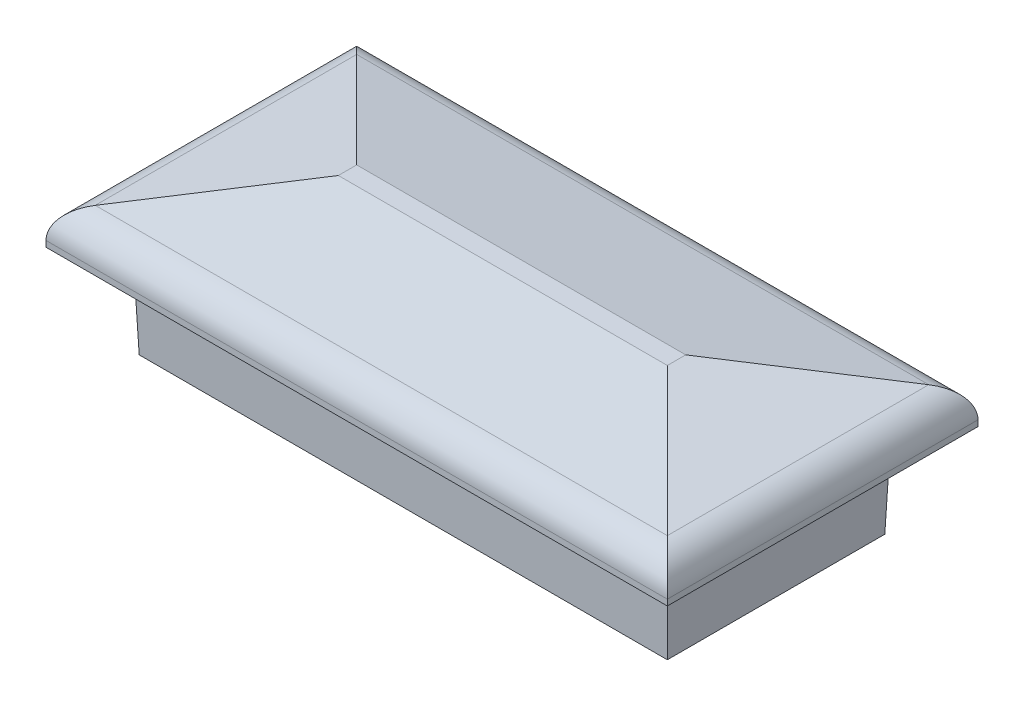
ISO-10303-21;
HEADER;
FILE_DESCRIPTION(('STEP AP214'),'2;1');
FILE_NAME('part.step','',(''),(''),'','','');
FILE_SCHEMA(('AUTOMOTIVE_DESIGN { 1 0 10303 214 1 1 1 1 }'));
ENDSEC;
DATA;
#1=APPLICATION_CONTEXT('core data for automotive mechanical design processes');
#2=APPLICATION_PROTOCOL_DEFINITION('international standard','automotive_design',2000,#1);
#3=PRODUCT_CONTEXT('',#1,'mechanical');
#4=PRODUCT('Part','Part','',(#3));
#5=PRODUCT_RELATED_PRODUCT_CATEGORY('part','',(#4));
#6=PRODUCT_DEFINITION_FORMATION('','',#4);
#7=PRODUCT_DEFINITION_CONTEXT('part definition',#1,'design');
#8=PRODUCT_DEFINITION('design','',#6,#7);
#9=PRODUCT_DEFINITION_SHAPE('','',#8);
#10=(LENGTH_UNIT() NAMED_UNIT(*) SI_UNIT(.MILLI.,.METRE.));
#11=(NAMED_UNIT(*) PLANE_ANGLE_UNIT() SI_UNIT($,.RADIAN.));
#12=(NAMED_UNIT(*) SI_UNIT($,.STERADIAN.) SOLID_ANGLE_UNIT());
#13=UNCERTAINTY_MEASURE_WITH_UNIT(LENGTH_MEASURE(1.E-05),#10,'distance_accuracy_value','');
#14=(GEOMETRIC_REPRESENTATION_CONTEXT(3) GLOBAL_UNCERTAINTY_ASSIGNED_CONTEXT((#13)) GLOBAL_UNIT_ASSIGNED_CONTEXT((#10,
#11,#12)) REPRESENTATION_CONTEXT('',''));
#15=CARTESIAN_POINT('',(0.,0.,0.));
#16=DIRECTION('',(0.,0.,1.));
#17=DIRECTION('',(1.,0.,0.));
#18=AXIS2_PLACEMENT_3D('',#15,#16,#17);
#19=CARTESIAN_POINT('',(0.,0.,0.));
#20=DIRECTION('',(0.,1.,0.));
#21=DIRECTION('',(0.,0.,1.));
#22=AXIS2_PLACEMENT_3D('',#19,#20,#21);
#23=PLANE('',#22);
#24=DIRECTION('',(-1.,0.,0.));
#25=VECTOR('',#24,1.);
#26=CARTESIAN_POINT('',(0.,0.,8.88999999999992));
#27=LINE('',#26,#25);
#28=CARTESIAN_POINT('',(21.5899999999999,0.,8.88999999999992));
#29=VERTEX_POINT('',#28);
#30=CARTESIAN_POINT('',(-21.5899999999999,0.,8.88999999999992));
#31=VERTEX_POINT('',#30);
#32=EDGE_CURVE('E234',#29,#31,#27,.T.);
#33=ORIENTED_EDGE('',*,*,#32,.T.);
#34=DIRECTION('',(0.,0.,-1.));
#35=VECTOR('',#34,1.);
#36=CARTESIAN_POINT('',(-21.5899999999999,0.,0.));
#37=LINE('',#36,#35);
#38=CARTESIAN_POINT('',(-21.5899999999999,0.,-8.88999999999992));
#39=VERTEX_POINT('',#38);
#40=EDGE_CURVE('E240',#31,#39,#37,.T.);
#41=ORIENTED_EDGE('',*,*,#40,.T.);
#42=DIRECTION('',(1.,0.,0.));
#43=VECTOR('',#42,1.);
#44=CARTESIAN_POINT('',(0.,0.,-8.88999999999992));
#45=LINE('',#44,#43);
#46=CARTESIAN_POINT('',(21.5899999999999,0.,-8.88999999999992));
#47=VERTEX_POINT('',#46);
#48=EDGE_CURVE('E238',#39,#47,#45,.T.);
#49=ORIENTED_EDGE('',*,*,#48,.T.);
#50=DIRECTION('',(0.,0.,1.));
#51=VECTOR('',#50,1.);
#52=CARTESIAN_POINT('',(21.5899999999999,0.,0.));
#53=LINE('',#52,#51);
#54=EDGE_CURVE('E236',#47,#29,#53,.T.);
#55=ORIENTED_EDGE('',*,*,#54,.T.);
#56=EDGE_LOOP('',(#33,#41,#49,#55));
#57=FACE_BOUND('',#56,.T.);
#58=DIRECTION('',(1.,0.,0.));
#59=VECTOR('',#58,1.);
#60=CARTESIAN_POINT('',(-21.971,0.,6.34845175748091));
#61=LINE('',#60,#59);
#62=CARTESIAN_POINT('',(19.0484517574809,0.,6.34845175748091));
#63=VERTEX_POINT('',#62);
#64=CARTESIAN_POINT('',(-19.0484517574809,0.,6.34845175748091));
#65=VERTEX_POINT('',#64);
#66=EDGE_CURVE('E199',#63,#65,#61,.F.);
#67=ORIENTED_EDGE('',*,*,#66,.F.);
#68=DIRECTION('',(0.,0.,-1.));
#69=VECTOR('',#68,1.);
#70=CARTESIAN_POINT('',(19.0484517574809,0.,-9.271));
#71=LINE('',#70,#69);
#72=CARTESIAN_POINT('',(19.0484517574809,0.,-6.34845175748092));
#73=VERTEX_POINT('',#72);
#74=EDGE_CURVE('E211',#73,#63,#71,.F.);
#75=ORIENTED_EDGE('',*,*,#74,.F.);
#76=DIRECTION('',(-1.,0.,0.));
#77=VECTOR('',#76,1.);
#78=CARTESIAN_POINT('',(-21.971,0.,-6.34845175748092));
#79=LINE('',#78,#77);
#80=CARTESIAN_POINT('',(-19.0484517574809,0.,-6.34845175748092));
#81=VERTEX_POINT('',#80);
#82=EDGE_CURVE('E213',#81,#73,#79,.F.);
#83=ORIENTED_EDGE('',*,*,#82,.F.);
#84=DIRECTION('',(0.,0.,1.));
#85=VECTOR('',#84,1.);
#86=CARTESIAN_POINT('',(-19.0484517574809,0.,-9.271));
#87=LINE('',#86,#85);
#88=EDGE_CURVE('E215',#65,#81,#87,.F.);
#89=ORIENTED_EDGE('',*,*,#88,.F.);
#90=EDGE_LOOP('',(#67,#75,#83,#89));
#91=FACE_BOUND('',#90,.T.);
#92=ADVANCED_FACE('F39',(#57,#91),#23,.F.);
#93=CARTESIAN_POINT('',(21.971,10.910412500794,-9.271));
#94=DIRECTION('',(-0.999390827019096,0.0348994967024979,0.));
#95=DIRECTION('',(0.,0.,-1.));
#96=AXIS2_PLACEMENT_3D('',#93,#94,#95);
#97=PLANE('',#96);
#98=DIRECTION('',(0.0348782627423715,0.998782765958718,0.0348782627423717));
#99=VECTOR('',#98,1.);
#100=CARTESIAN_POINT('',(21.9175448552815,9.37965743736147,9.21754485528155));
#101=LINE('',#100,#99);
#102=CARTESIAN_POINT('',(21.856096263527,7.62,9.15609626352702));
#103=VERTEX_POINT('',#102);
#104=EDGE_CURVE('E247',#29,#103,#101,.T.);
#105=ORIENTED_EDGE('',*,*,#104,.F.);
#106=ORIENTED_EDGE('',*,*,#54,.F.);
#107=DIRECTION('',(0.0348782627423715,0.998782765958718,-0.0348782627423717));
#108=VECTOR('',#107,1.);
#109=CARTESIAN_POINT('',(21.971,10.910412500794,-9.271));
#110=LINE('',#109,#108);
#111=CARTESIAN_POINT('',(21.856096263527,7.62,-9.15609626352702));
#112=VERTEX_POINT('',#111);
#113=EDGE_CURVE('E225',#112,#47,#110,.F.);
#114=ORIENTED_EDGE('',*,*,#113,.F.);
#115=DIRECTION('',(0.,0.,1.));
#116=VECTOR('',#115,1.);
#117=CARTESIAN_POINT('',(21.856096263527,7.62,0.));
#118=LINE('',#117,#116);
#119=EDGE_CURVE('E224',#103,#112,#118,.F.);
#120=ORIENTED_EDGE('',*,*,#119,.F.);
#121=EDGE_LOOP('',(#105,#106,#114,#120));
#122=FACE_BOUND('',#121,.T.);
#123=ADVANCED_FACE('F328',(#122),#97,.F.);
#124=CARTESIAN_POINT('',(-21.971,10.910412500794,-9.271));
#125=DIRECTION('',(0.,0.034899496702498,0.999390827019096));
#126=DIRECTION('',(-1.,0.,0.));
#127=AXIS2_PLACEMENT_3D('',#124,#125,#126);
#128=PLANE('',#127);
#129=ORIENTED_EDGE('',*,*,#113,.T.);
#130=ORIENTED_EDGE('',*,*,#48,.F.);
#131=DIRECTION('',(-0.0348782627423715,0.998782765958718,-0.0348782627423717));
#132=VECTOR('',#131,1.);
#133=CARTESIAN_POINT('',(-21.971,10.910412500794,-9.271));
#134=LINE('',#133,#132);
#135=CARTESIAN_POINT('',(-21.856096263527,7.62,-9.15609626352702));
#136=VERTEX_POINT('',#135);
#137=EDGE_CURVE('E245',#136,#39,#134,.F.);
#138=ORIENTED_EDGE('',*,*,#137,.F.);
#139=DIRECTION('',(1.,0.,0.));
#140=VECTOR('',#139,1.);
#141=CARTESIAN_POINT('',(0.,7.62,-9.15609626352702));
#142=LINE('',#141,#140);
#143=EDGE_CURVE('E228',#112,#136,#142,.F.);
#144=ORIENTED_EDGE('',*,*,#143,.F.);
#145=EDGE_LOOP('',(#129,#130,#138,#144));
#146=FACE_BOUND('',#145,.T.);
#147=ADVANCED_FACE('F334',(#146),#128,.F.);
#148=CARTESIAN_POINT('',(-21.971,10.910412500794,9.271));
#149=DIRECTION('',(0.,0.034899496702498,-0.999390827019096));
#150=DIRECTION('',(1.,0.,0.));
#151=AXIS2_PLACEMENT_3D('',#148,#149,#150);
#152=PLANE('',#151);
#153=ORIENTED_EDGE('',*,*,#104,.T.);
#154=DIRECTION('',(-1.,0.,0.));
#155=VECTOR('',#154,1.);
#156=CARTESIAN_POINT('',(0.,7.62,9.15609626352702));
#157=LINE('',#156,#155);
#158=CARTESIAN_POINT('',(-21.856096263527,7.62,9.15609626352702));
#159=VERTEX_POINT('',#158);
#160=EDGE_CURVE('E221',#159,#103,#157,.F.);
#161=ORIENTED_EDGE('',*,*,#160,.F.);
#162=DIRECTION('',(0.0348782627423715,-0.998782765958718,-0.0348782627423717));
#163=VECTOR('',#162,1.);
#164=CARTESIAN_POINT('',(-21.971,10.910412500794,9.271));
#165=LINE('',#164,#163);
#166=EDGE_CURVE('E218',#31,#159,#165,.F.);
#167=ORIENTED_EDGE('',*,*,#166,.F.);
#168=ORIENTED_EDGE('',*,*,#32,.F.);
#169=EDGE_LOOP('',(#153,#161,#167,#168));
#170=FACE_BOUND('',#169,.T.);
#171=ADVANCED_FACE('F351',(#170),#152,.F.);
#172=CARTESIAN_POINT('',(-21.971,10.910412500794,-9.271));
#173=DIRECTION('',(0.999390827019096,0.0348994967024979,0.));
#174=DIRECTION('',(0.,0.,1.));
#175=AXIS2_PLACEMENT_3D('',#172,#173,#174);
#176=PLANE('',#175);
#177=ORIENTED_EDGE('',*,*,#137,.T.);
#178=ORIENTED_EDGE('',*,*,#40,.F.);
#179=ORIENTED_EDGE('',*,*,#166,.T.);
#180=DIRECTION('',(0.,0.,-1.));
#181=VECTOR('',#180,1.);
#182=CARTESIAN_POINT('',(-21.856096263527,7.62,0.));
#183=LINE('',#182,#181);
#184=EDGE_CURVE('E231',#136,#159,#183,.F.);
#185=ORIENTED_EDGE('',*,*,#184,.F.);
#186=EDGE_LOOP('',(#177,#178,#179,#185));
#187=FACE_BOUND('',#186,.T.);
#188=ADVANCED_FACE('F343',(#187),#176,.F.);
#189=CARTESIAN_POINT('',(0.,5.08,0.));
#190=DIRECTION('',(0.,1.,0.));
#191=DIRECTION('',(0.,0.,1.));
#192=AXIS2_PLACEMENT_3D('',#189,#190,#191);
#193=PLANE('',#192);
#194=DIRECTION('',(1.,0.,0.));
#195=VECTOR('',#194,1.);
#196=CARTESIAN_POINT('',(0.,5.08,-6.52584926649898));
#197=LINE('',#196,#195);
#198=CARTESIAN_POINT('',(19.225849266499,5.08,-6.52584926649898));
#199=VERTEX_POINT('',#198);
#200=CARTESIAN_POINT('',(-19.225849266499,5.08,-6.52584926649898));
#201=VERTEX_POINT('',#200);
#202=EDGE_CURVE('E193',#199,#201,#197,.F.);
#203=ORIENTED_EDGE('',*,*,#202,.F.);
#204=DIRECTION('',(0.,0.,1.));
#205=VECTOR('',#204,1.);
#206=CARTESIAN_POINT('',(19.225849266499,5.08,0.));
#207=LINE('',#206,#205);
#208=CARTESIAN_POINT('',(19.225849266499,5.08,6.52584926649898));
#209=VERTEX_POINT('',#208);
#210=EDGE_CURVE('E196',#209,#199,#207,.F.);
#211=ORIENTED_EDGE('',*,*,#210,.F.);
#212=DIRECTION('',(-1.,0.,0.));
#213=VECTOR('',#212,1.);
#214=CARTESIAN_POINT('',(0.,5.08,6.52584926649898));
#215=LINE('',#214,#213);
#216=CARTESIAN_POINT('',(-19.225849266499,5.08,6.52584926649898));
#217=VERTEX_POINT('',#216);
#218=EDGE_CURVE('E200',#217,#209,#215,.F.);
#219=ORIENTED_EDGE('',*,*,#218,.F.);
#220=DIRECTION('',(0.,0.,-1.));
#221=VECTOR('',#220,1.);
#222=CARTESIAN_POINT('',(-19.225849266499,5.08,0.));
#223=LINE('',#222,#221);
#224=EDGE_CURVE('E195',#201,#217,#223,.F.);
#225=ORIENTED_EDGE('',*,*,#224,.F.);
#226=EDGE_LOOP('',(#203,#211,#219,#225));
#227=FACE_BOUND('',#226,.T.);
#228=ADVANCED_FACE('F350',(#227),#193,.F.);
#229=CARTESIAN_POINT('',(19.4325472993715,10.9990572224183,-9.271));
#230=DIRECTION('',(-0.999390827019096,0.0348994967024979,0.));
#231=DIRECTION('',(0.,0.,-1.));
#232=AXIS2_PLACEMENT_3D('',#229,#230,#231);
#233=PLANE('',#232);
#234=DIRECTION('',(0.0348782627423715,0.998782765958718,0.0348782627423717));
#235=VECTOR('',#234,1.);
#236=CARTESIAN_POINT('',(19.3821801651322,9.5567312092059,6.68218016513216));
#237=LINE('',#236,#235);
#238=EDGE_CURVE('E204',#63,#209,#237,.T.);
#239=ORIENTED_EDGE('',*,*,#238,.T.);
#240=ORIENTED_EDGE('',*,*,#210,.T.);
#241=DIRECTION('',(-0.0348782627423715,-0.998782765958718,0.0348782627423717));
#242=VECTOR('',#241,1.);
#243=CARTESIAN_POINT('',(19.3821801651322,9.5567312092059,-6.68218016513216));
#244=LINE('',#243,#242);
#245=EDGE_CURVE('E202',#199,#73,#244,.T.);
#246=ORIENTED_EDGE('',*,*,#245,.T.);
#247=ORIENTED_EDGE('',*,*,#74,.T.);
#248=EDGE_LOOP('',(#239,#240,#246,#247));
#249=FACE_BOUND('',#248,.T.);
#250=ADVANCED_FACE('F473',(#249),#233,.T.);
#251=CARTESIAN_POINT('',(-21.971,10.9990572224183,-6.7325472993715));
#252=DIRECTION('',(0.,0.034899496702498,0.999390827019096));
#253=DIRECTION('',(-1.,0.,0.));
#254=AXIS2_PLACEMENT_3D('',#251,#252,#253);
#255=PLANE('',#254);
#256=ORIENTED_EDGE('',*,*,#245,.F.);
#257=ORIENTED_EDGE('',*,*,#202,.T.);
#258=DIRECTION('',(0.0348782627423715,-0.998782765958718,0.0348782627423717));
#259=VECTOR('',#258,1.);
#260=CARTESIAN_POINT('',(-19.4356353098506,11.0874862726384,-6.73563530985061));
#261=LINE('',#260,#259);
#262=EDGE_CURVE('E207',#201,#81,#261,.T.);
#263=ORIENTED_EDGE('',*,*,#262,.T.);
#264=ORIENTED_EDGE('',*,*,#82,.T.);
#265=EDGE_LOOP('',(#256,#257,#263,#264));
#266=FACE_BOUND('',#265,.T.);
#267=ADVANCED_FACE('F466',(#266),#255,.T.);
#268=CARTESIAN_POINT('',(-21.971,10.9990572224183,6.73254729937149));
#269=DIRECTION('',(0.,0.034899496702498,-0.999390827019096));
#270=DIRECTION('',(1.,0.,0.));
#271=AXIS2_PLACEMENT_3D('',#268,#269,#270);
#272=PLANE('',#271);
#273=ORIENTED_EDGE('',*,*,#238,.F.);
#274=ORIENTED_EDGE('',*,*,#66,.T.);
#275=DIRECTION('',(-0.0348782627423715,0.998782765958718,0.0348782627423717));
#276=VECTOR('',#275,1.);
#277=CARTESIAN_POINT('',(-19.4130790927151,10.4415607256409,6.71307909271508));
#278=LINE('',#277,#276);
#279=EDGE_CURVE('E165',#65,#217,#278,.T.);
#280=ORIENTED_EDGE('',*,*,#279,.T.);
#281=ORIENTED_EDGE('',*,*,#218,.T.);
#282=EDGE_LOOP('',(#273,#274,#280,#281));
#283=FACE_BOUND('',#282,.T.);
#284=ADVANCED_FACE('F458',(#283),#272,.T.);
#285=CARTESIAN_POINT('',(-19.4325472993715,10.9990572224183,-9.271));
#286=DIRECTION('',(0.999390827019096,0.0348994967024979,0.));
#287=DIRECTION('',(0.,0.,1.));
#288=AXIS2_PLACEMENT_3D('',#285,#286,#287);
#289=PLANE('',#288);
#290=ORIENTED_EDGE('',*,*,#262,.F.);
#291=ORIENTED_EDGE('',*,*,#224,.T.);
#292=ORIENTED_EDGE('',*,*,#279,.F.);
#293=ORIENTED_EDGE('',*,*,#88,.T.);
#294=EDGE_LOOP('',(#290,#291,#292,#293));
#295=FACE_BOUND('',#294,.T.);
#296=ADVANCED_FACE('F340',(#295),#289,.T.);
#297=CARTESIAN_POINT('',(0.,7.62,0.));
#298=DIRECTION('',(0.,1.,0.));
#299=DIRECTION('',(0.,0.,1.));
#300=AXIS2_PLACEMENT_3D('',#297,#298,#299);
#301=PLANE('',#300);
#302=DIRECTION('',(0.,0.,1.));
#303=VECTOR('',#302,1.);
#304=CARTESIAN_POINT('',(-25.4,7.62,12.7));
#305=LINE('',#304,#303);
#306=CARTESIAN_POINT('',(-25.4,7.62,-12.7));
#307=VERTEX_POINT('',#306);
#308=CARTESIAN_POINT('',(-25.4,7.62,12.7));
#309=VERTEX_POINT('',#308);
#310=EDGE_CURVE('E173',#307,#309,#305,.T.);
#311=ORIENTED_EDGE('',*,*,#310,.F.);
#312=DIRECTION('',(-1.,0.,0.));
#313=VECTOR('',#312,1.);
#314=CARTESIAN_POINT('',(25.4,7.62,-12.7));
#315=LINE('',#314,#313);
#316=CARTESIAN_POINT('',(25.4,7.62,-12.7));
#317=VERTEX_POINT('',#316);
#318=EDGE_CURVE('E187',#317,#307,#315,.T.);
#319=ORIENTED_EDGE('',*,*,#318,.F.);
#320=DIRECTION('',(0.,0.,-1.));
#321=VECTOR('',#320,1.);
#322=CARTESIAN_POINT('',(25.4,7.62,12.7));
#323=LINE('',#322,#321);
#324=CARTESIAN_POINT('',(25.4,7.62,12.7));
#325=VERTEX_POINT('',#324);
#326=EDGE_CURVE('E175',#325,#317,#323,.T.);
#327=ORIENTED_EDGE('',*,*,#326,.F.);
#328=DIRECTION('',(1.,0.,0.));
#329=VECTOR('',#328,1.);
#330=CARTESIAN_POINT('',(25.4,7.62,12.7));
#331=LINE('',#330,#329);
#332=EDGE_CURVE('E159',#309,#325,#331,.T.);
#333=ORIENTED_EDGE('',*,*,#332,.F.);
#334=EDGE_LOOP('',(#311,#319,#327,#333));
#335=FACE_BOUND('',#334,.T.);
#336=ORIENTED_EDGE('',*,*,#119,.T.);
#337=ORIENTED_EDGE('',*,*,#143,.T.);
#338=ORIENTED_EDGE('',*,*,#184,.T.);
#339=ORIENTED_EDGE('',*,*,#160,.T.);
#340=EDGE_LOOP('',(#336,#337,#338,#339));
#341=FACE_BOUND('',#340,.T.);
#342=ADVANCED_FACE('F170',(#335,#341),#301,.F.);
#343=CARTESIAN_POINT('',(-25.4,12.7,12.7));
#344=DIRECTION('',(1.,0.,0.));
#345=DIRECTION('',(0.,0.,-1.));
#346=AXIS2_PLACEMENT_3D('',#343,#344,#345);
#347=PLANE('',#346);
#348=DIRECTION('',(0.,-1.,0.));
#349=VECTOR('',#348,1.);
#350=CARTESIAN_POINT('',(-25.4,12.7,12.7));
#351=LINE('',#350,#349);
#352=CARTESIAN_POINT('',(-25.4,8.10314855568468,12.7));
#353=VERTEX_POINT('',#352);
#354=EDGE_CURVE('E155',#353,#309,#351,.T.);
#355=ORIENTED_EDGE('',*,*,#354,.F.);
#356=DIRECTION('',(0.,0.,-1.));
#357=VECTOR('',#356,1.);
#358=CARTESIAN_POINT('',(-25.4,8.10314855568468,-12.7));
#359=LINE('',#358,#357);
#360=CARTESIAN_POINT('',(-25.4,8.10314855568468,-12.7));
#361=VERTEX_POINT('',#360);
#362=EDGE_CURVE('E271',#353,#361,#359,.T.);
#363=ORIENTED_EDGE('',*,*,#362,.T.);
#364=DIRECTION('',(0.,-1.,0.));
#365=VECTOR('',#364,1.);
#366=CARTESIAN_POINT('',(-25.4,12.7,-12.7));
#367=LINE('',#366,#365);
#368=EDGE_CURVE('E178',#361,#307,#367,.T.);
#369=ORIENTED_EDGE('',*,*,#368,.T.);
#370=ORIENTED_EDGE('',*,*,#310,.T.);
#371=EDGE_LOOP('',(#355,#363,#369,#370));
#372=FACE_BOUND('',#371,.T.);
#373=ADVANCED_FACE('F177',(#372),#347,.F.);
#374=CARTESIAN_POINT('',(25.4,12.7,12.7));
#375=DIRECTION('',(0.,0.,-1.));
#376=DIRECTION('',(-1.,0.,0.));
#377=AXIS2_PLACEMENT_3D('',#374,#375,#376);
#378=PLANE('',#377);
#379=DIRECTION('',(0.,-1.,0.));
#380=VECTOR('',#379,1.);
#381=CARTESIAN_POINT('',(25.4,12.7,12.7));
#382=LINE('',#381,#380);
#383=CARTESIAN_POINT('',(25.4,8.10314855568468,12.7));
#384=VERTEX_POINT('',#383);
#385=EDGE_CURVE('E166',#384,#325,#382,.T.);
#386=ORIENTED_EDGE('',*,*,#385,.F.);
#387=DIRECTION('',(-1.,0.,0.));
#388=VECTOR('',#387,1.);
#389=CARTESIAN_POINT('',(-25.4,8.10314855568468,12.7));
#390=LINE('',#389,#388);
#391=EDGE_CURVE('E162',#384,#353,#390,.T.);
#392=ORIENTED_EDGE('',*,*,#391,.T.);
#393=ORIENTED_EDGE('',*,*,#354,.T.);
#394=ORIENTED_EDGE('',*,*,#332,.T.);
#395=EDGE_LOOP('',(#386,#392,#393,#394));
#396=FACE_BOUND('',#395,.T.);
#397=ADVANCED_FACE('F158',(#396),#378,.F.);
#398=CARTESIAN_POINT('',(25.4,12.7,12.7));
#399=DIRECTION('',(-1.,0.,0.));
#400=DIRECTION('',(0.,0.,1.));
#401=AXIS2_PLACEMENT_3D('',#398,#399,#400);
#402=PLANE('',#401);
#403=DIRECTION('',(0.,-1.,0.));
#404=VECTOR('',#403,1.);
#405=CARTESIAN_POINT('',(25.4,12.7,-12.7));
#406=LINE('',#405,#404);
#407=CARTESIAN_POINT('',(25.4,8.10314855568468,-12.7));
#408=VERTEX_POINT('',#407);
#409=EDGE_CURVE('E190',#408,#317,#406,.T.);
#410=ORIENTED_EDGE('',*,*,#409,.F.);
#411=DIRECTION('',(0.,0.,1.));
#412=VECTOR('',#411,1.);
#413=CARTESIAN_POINT('',(25.4,8.10314855568468,12.7));
#414=LINE('',#413,#412);
#415=EDGE_CURVE('E275',#408,#384,#414,.T.);
#416=ORIENTED_EDGE('',*,*,#415,.T.);
#417=ORIENTED_EDGE('',*,*,#385,.T.);
#418=ORIENTED_EDGE('',*,*,#326,.T.);
#419=EDGE_LOOP('',(#410,#416,#417,#418));
#420=FACE_BOUND('',#419,.T.);
#421=ADVANCED_FACE('F318',(#420),#402,.F.);
#422=CARTESIAN_POINT('',(25.4,12.7,-12.7));
#423=DIRECTION('',(0.,0.,1.));
#424=DIRECTION('',(1.,0.,0.));
#425=AXIS2_PLACEMENT_3D('',#422,#423,#424);
#426=PLANE('',#425);
#427=ORIENTED_EDGE('',*,*,#368,.F.);
#428=DIRECTION('',(1.,0.,0.));
#429=VECTOR('',#428,1.);
#430=CARTESIAN_POINT('',(25.4,8.10314855568468,-12.7));
#431=LINE('',#430,#429);
#432=EDGE_CURVE('E48',#361,#408,#431,.T.);
#433=ORIENTED_EDGE('',*,*,#432,.T.);
#434=ORIENTED_EDGE('',*,*,#409,.T.);
#435=ORIENTED_EDGE('',*,*,#318,.T.);
#436=EDGE_LOOP('',(#427,#433,#434,#435));
#437=FACE_BOUND('',#436,.T.);
#438=ADVANCED_FACE('F316',(#437),#426,.F.);
#439=CARTESIAN_POINT('',(0.,12.7,0.));
#440=DIRECTION('',(0.,1.,0.));
#441=DIRECTION('',(0.,0.,1.));
#442=AXIS2_PLACEMENT_3D('',#439,#440,#441);
#443=PLANE('',#442);
#444=DIRECTION('',(0.,0.,1.));
#445=VECTOR('',#444,1.);
#446=CARTESIAN_POINT('',(-13.4502395219248,12.7,12.7));
#447=LINE('',#446,#445);
#448=CARTESIAN_POINT('',(-13.4502395219248,12.7,-0.750239521924812));
#449=VERTEX_POINT('',#448);
#450=CARTESIAN_POINT('',(-13.4502395219248,12.7,0.750239521924812));
#451=VERTEX_POINT('',#450);
#452=EDGE_CURVE('E256',#449,#451,#447,.T.);
#453=ORIENTED_EDGE('',*,*,#452,.T.);
#454=DIRECTION('',(1.,0.,0.));
#455=VECTOR('',#454,1.);
#456=CARTESIAN_POINT('',(25.4,12.7,0.750239521924807));
#457=LINE('',#456,#455);
#458=CARTESIAN_POINT('',(13.4502395219248,12.7,0.750239521924809));
#459=VERTEX_POINT('',#458);
#460=EDGE_CURVE('E258',#451,#459,#457,.T.);
#461=ORIENTED_EDGE('',*,*,#460,.T.);
#462=DIRECTION('',(0.,0.,-1.));
#463=VECTOR('',#462,1.);
#464=CARTESIAN_POINT('',(13.4502395219248,12.7,-12.7));
#465=LINE('',#464,#463);
#466=CARTESIAN_POINT('',(13.4502395219248,12.7,-0.750239521924816));
#467=VERTEX_POINT('',#466);
#468=EDGE_CURVE('E243',#459,#467,#465,.T.);
#469=ORIENTED_EDGE('',*,*,#468,.T.);
#470=DIRECTION('',(-1.,0.,0.));
#471=VECTOR('',#470,1.);
#472=CARTESIAN_POINT('',(-25.4,12.7,-0.75023952192481));
#473=LINE('',#472,#471);
#474=EDGE_CURVE('E254',#467,#449,#473,.T.);
#475=ORIENTED_EDGE('',*,*,#474,.T.);
#476=EDGE_LOOP('',(#453,#461,#469,#475));
#477=FACE_BOUND('',#476,.T.);
#478=ADVANCED_FACE('F306',(#477),#443,.T.);
#479=CARTESIAN_POINT('',(0.,12.7,-0.750239521924814));
#480=DIRECTION('',(0.,0.978147600733805,-0.207911690817761));
#481=DIRECTION('',(1.,0.,0.));
#482=AXIS2_PLACEMENT_3D('',#479,#480,#481);
#483=PLANE('',#482);
#484=DIRECTION('',(-0.699252778086875,0.148630766248358,0.699252778086875));
#485=VECTOR('',#484,1.);
#486=CARTESIAN_POINT('',(13.0834065708677,12.777972750784,-0.383406570867705));
#487=LINE('',#486,#485);
#488=CARTESIAN_POINT('',(23.3880956946771,10.5876434615486,-10.6880956946771));
#489=VERTEX_POINT('',#488);
#490=EDGE_CURVE('E183',#489,#467,#487,.T.);
#491=ORIENTED_EDGE('',*,*,#490,.F.);
#492=DIRECTION('',(1.,0.,0.));
#493=VECTOR('',#492,1.);
#494=CARTESIAN_POINT('',(-25.4,10.5876434615485,-10.6880956946771));
#495=LINE('',#494,#493);
#496=CARTESIAN_POINT('',(-23.3880956946771,10.5876434615486,-10.6880956946771));
#497=VERTEX_POINT('',#496);
#498=EDGE_CURVE('E11',#489,#497,#495,.F.);
#499=ORIENTED_EDGE('',*,*,#498,.T.);
#500=DIRECTION('',(0.699252778086875,0.148630766248358,0.699252778086875));
#501=VECTOR('',#500,1.);
#502=CARTESIAN_POINT('',(-6.8736850855576,14.09788979863,5.8263149144424));
#503=LINE('',#502,#501);
#504=EDGE_CURVE('E180',#449,#497,#503,.F.);
#505=ORIENTED_EDGE('',*,*,#504,.F.);
#506=ORIENTED_EDGE('',*,*,#474,.F.);
#507=EDGE_LOOP('',(#491,#499,#505,#506));
#508=FACE_BOUND('',#507,.T.);
#509=ADVANCED_FACE('F298',(#508),#483,.T.);
#510=CARTESIAN_POINT('',(-13.4502395219248,12.7,0.));
#511=DIRECTION('',(-0.207911690817761,0.978147600733805,0.));
#512=DIRECTION('',(0.,0.,-1.));
#513=AXIS2_PLACEMENT_3D('',#510,#511,#512);
#514=PLANE('',#513);
#515=ORIENTED_EDGE('',*,*,#504,.T.);
#516=DIRECTION('',(0.,0.,-1.));
#517=VECTOR('',#516,1.);
#518=CARTESIAN_POINT('',(-23.3880956946771,10.5876434615485,12.7));
#519=LINE('',#518,#517);
#520=CARTESIAN_POINT('',(-23.3880956946771,10.5876434615486,10.6880956946771));
#521=VERTEX_POINT('',#520);
#522=EDGE_CURVE('E273',#497,#521,#519,.F.);
#523=ORIENTED_EDGE('',*,*,#522,.T.);
#524=DIRECTION('',(0.699252778086875,0.148630766248358,-0.699252778086875));
#525=VECTOR('',#524,1.);
#526=CARTESIAN_POINT('',(-13.0834065708677,12.777972750784,0.383406570867703));
#527=LINE('',#526,#525);
#528=EDGE_CURVE('E263',#451,#521,#527,.F.);
#529=ORIENTED_EDGE('',*,*,#528,.F.);
#530=ORIENTED_EDGE('',*,*,#452,.F.);
#531=EDGE_LOOP('',(#515,#523,#529,#530));
#532=FACE_BOUND('',#531,.T.);
#533=ADVANCED_FACE('F302',(#532),#514,.T.);
#534=CARTESIAN_POINT('',(13.4502395219248,12.7,0.));
#535=DIRECTION('',(0.207911690817761,0.978147600733805,0.));
#536=DIRECTION('',(0.,0.,1.));
#537=AXIS2_PLACEMENT_3D('',#534,#535,#536);
#538=PLANE('',#537);
#539=DIRECTION('',(0.699252778086875,-0.148630766248358,0.699252778086875));
#540=VECTOR('',#539,1.);
#541=CARTESIAN_POINT('',(13.0834065708677,12.777972750784,0.383406570867701));
#542=LINE('',#541,#540);
#543=CARTESIAN_POINT('',(23.3880956946771,10.5876434615486,10.6880956946771));
#544=VERTEX_POINT('',#543);
#545=EDGE_CURVE('E261',#544,#459,#542,.F.);
#546=ORIENTED_EDGE('',*,*,#545,.F.);
#547=DIRECTION('',(0.,0.,1.));
#548=VECTOR('',#547,1.);
#549=CARTESIAN_POINT('',(23.3880956946771,10.5876434615485,-12.7));
#550=LINE('',#549,#548);
#551=EDGE_CURVE('E56',#544,#489,#550,.F.);
#552=ORIENTED_EDGE('',*,*,#551,.T.);
#553=ORIENTED_EDGE('',*,*,#490,.T.);
#554=ORIENTED_EDGE('',*,*,#468,.F.);
#555=EDGE_LOOP('',(#546,#552,#553,#554));
#556=FACE_BOUND('',#555,.T.);
#557=ADVANCED_FACE('F308',(#556),#538,.T.);
#558=CARTESIAN_POINT('',(0.,12.7,0.75023952192481));
#559=DIRECTION('',(0.,0.978147600733805,0.207911690817761));
#560=DIRECTION('',(-1.,0.,0.));
#561=AXIS2_PLACEMENT_3D('',#558,#559,#560);
#562=PLANE('',#561);
#563=ORIENTED_EDGE('',*,*,#528,.T.);
#564=DIRECTION('',(-1.,0.,0.));
#565=VECTOR('',#564,1.);
#566=CARTESIAN_POINT('',(25.4,10.5876434615485,10.6880956946771));
#567=LINE('',#566,#565);
#568=EDGE_CURVE('E268',#521,#544,#567,.F.);
#569=ORIENTED_EDGE('',*,*,#568,.T.);
#570=ORIENTED_EDGE('',*,*,#545,.T.);
#571=ORIENTED_EDGE('',*,*,#460,.F.);
#572=EDGE_LOOP('',(#563,#569,#570,#571));
#573=FACE_BOUND('',#572,.T.);
#574=ADVANCED_FACE('F310',(#573),#562,.T.);
#575=CARTESIAN_POINT('',(25.4,8.10314855568468,-10.16));
#576=DIRECTION('',(-1.,0.,0.));
#577=DIRECTION('',(0.,0.,1.));
#578=AXIS2_PLACEMENT_3D('',#575,#576,#577);
#579=CYLINDRICAL_SURFACE('',#578,2.54);
#580=CARTESIAN_POINT('',(-22.86,8.10314855568468,-10.16));
#581=DIRECTION('',(-0.707106781186547,0.,0.707106781186548));
#582=DIRECTION('',(-0.707106781186548,0.,-0.707106781186547));
#583=AXIS2_PLACEMENT_3D('',#580,#581,#582);
#584=ELLIPSE('',#583,3.59210244842766,2.54);
#585=EDGE_CURVE('E282',#497,#361,#584,.T.);
#586=ORIENTED_EDGE('',*,*,#585,.F.);
#587=ORIENTED_EDGE('',*,*,#498,.F.);
#588=CARTESIAN_POINT('',(22.86,8.10314855568468,-10.16));
#589=DIRECTION('',(-0.707106781186548,0.,-0.707106781186547));
#590=DIRECTION('',(-0.707106781186547,0.,0.707106781186548));
#591=AXIS2_PLACEMENT_3D('',#588,#589,#590);
#592=ELLIPSE('',#591,3.59210244842766,2.54);
#593=EDGE_CURVE('E43',#408,#489,#592,.F.);
#594=ORIENTED_EDGE('',*,*,#593,.F.);
#595=ORIENTED_EDGE('',*,*,#432,.F.);
#596=EDGE_LOOP('',(#586,#587,#594,#595));
#597=FACE_BOUND('',#596,.T.);
#598=ADVANCED_FACE('F41',(#597),#579,.T.);
#599=CARTESIAN_POINT('',(22.86,8.10314855568468,12.7));
#600=DIRECTION('',(0.,0.,-1.));
#601=DIRECTION('',(-1.,0.,0.));
#602=AXIS2_PLACEMENT_3D('',#599,#600,#601);
#603=CYLINDRICAL_SURFACE('',#602,2.54);
#604=ORIENTED_EDGE('',*,*,#593,.T.);
#605=ORIENTED_EDGE('',*,*,#551,.F.);
#606=CARTESIAN_POINT('',(22.86,8.10314855568468,10.16));
#607=DIRECTION('',(0.707106781186547,0.,-0.707106781186548));
#608=DIRECTION('',(-0.707106781186548,0.,-0.707106781186547));
#609=AXIS2_PLACEMENT_3D('',#606,#607,#608);
#610=ELLIPSE('',#609,3.59210244842766,2.54);
#611=EDGE_CURVE('E281',#384,#544,#610,.F.);
#612=ORIENTED_EDGE('',*,*,#611,.F.);
#613=ORIENTED_EDGE('',*,*,#415,.F.);
#614=EDGE_LOOP('',(#604,#605,#612,#613));
#615=FACE_BOUND('',#614,.T.);
#616=ADVANCED_FACE('F292',(#615),#603,.T.);
#617=CARTESIAN_POINT('',(-22.86,8.10314855568468,12.7));
#618=DIRECTION('',(0.,0.,1.));
#619=DIRECTION('',(1.,0.,0.));
#620=AXIS2_PLACEMENT_3D('',#617,#618,#619);
#621=CYLINDRICAL_SURFACE('',#620,2.54);
#622=ORIENTED_EDGE('',*,*,#585,.T.);
#623=ORIENTED_EDGE('',*,*,#362,.F.);
#624=CARTESIAN_POINT('',(-22.86,8.10314855568468,10.16));
#625=DIRECTION('',(0.707106781186548,0.,0.707106781186547));
#626=DIRECTION('',(-0.707106781186547,0.,0.707106781186548));
#627=AXIS2_PLACEMENT_3D('',#624,#625,#626);
#628=ELLIPSE('',#627,3.59210244842766,2.54);
#629=EDGE_CURVE('E279',#521,#353,#628,.T.);
#630=ORIENTED_EDGE('',*,*,#629,.F.);
#631=ORIENTED_EDGE('',*,*,#522,.F.);
#632=EDGE_LOOP('',(#622,#623,#630,#631));
#633=FACE_BOUND('',#632,.T.);
#634=ADVANCED_FACE('F315',(#633),#621,.T.);
#635=CARTESIAN_POINT('',(25.4,8.10314855568468,10.16));
#636=DIRECTION('',(1.,0.,0.));
#637=DIRECTION('',(0.,0.,-1.));
#638=AXIS2_PLACEMENT_3D('',#635,#636,#637);
#639=CYLINDRICAL_SURFACE('',#638,2.54);
#640=ORIENTED_EDGE('',*,*,#611,.T.);
#641=ORIENTED_EDGE('',*,*,#568,.F.);
#642=ORIENTED_EDGE('',*,*,#629,.T.);
#643=ORIENTED_EDGE('',*,*,#391,.F.);
#644=EDGE_LOOP('',(#640,#641,#642,#643));
#645=FACE_BOUND('',#644,.T.);
#646=ADVANCED_FACE('F314',(#645),#639,.T.);
#647=CLOSED_SHELL('',(#92,#123,#147,#171,#188,#228,#250,#267,#284,#296,#342,#373,#397,#421,#438,
#478,#509,#533,#557,#574,#598,#616,#634,#646));
#648=MANIFOLD_SOLID_BREP('B2',#647);
#649=ADVANCED_BREP_SHAPE_REPRESENTATION('',(#18,#648),#14);
#650=SHAPE_DEFINITION_REPRESENTATION(#9,#649);
ENDSEC;
END-ISO-10303-21;
